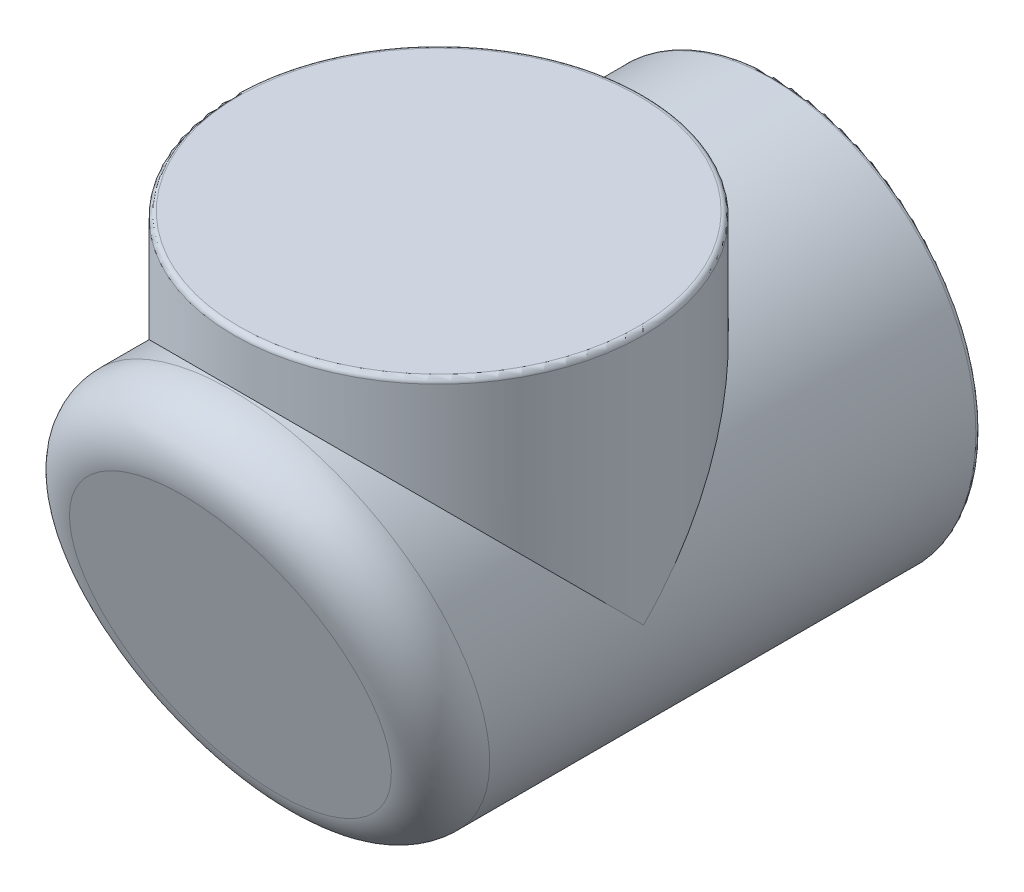
ISO-10303-21;
HEADER;
FILE_DESCRIPTION(('STEP AP214'),'2;1');
FILE_NAME('part.step','',(''),(''),'','','');
FILE_SCHEMA(('AUTOMOTIVE_DESIGN { 1 0 10303 214 1 1 1 1 }'));
ENDSEC;
DATA;
#1=APPLICATION_CONTEXT('core data for automotive mechanical design processes');
#2=APPLICATION_PROTOCOL_DEFINITION('international standard','automotive_design',2000,#1);
#3=PRODUCT_CONTEXT('',#1,'mechanical');
#4=PRODUCT('Part','Part','',(#3));
#5=PRODUCT_RELATED_PRODUCT_CATEGORY('part','',(#4));
#6=PRODUCT_DEFINITION_FORMATION('','',#4);
#7=PRODUCT_DEFINITION_CONTEXT('part definition',#1,'design');
#8=PRODUCT_DEFINITION('design','',#6,#7);
#9=PRODUCT_DEFINITION_SHAPE('','',#8);
#10=(LENGTH_UNIT() NAMED_UNIT(*) SI_UNIT(.MILLI.,.METRE.));
#11=(NAMED_UNIT(*) PLANE_ANGLE_UNIT() SI_UNIT($,.RADIAN.));
#12=(NAMED_UNIT(*) SI_UNIT($,.STERADIAN.) SOLID_ANGLE_UNIT());
#13=UNCERTAINTY_MEASURE_WITH_UNIT(LENGTH_MEASURE(1.E-05),#10,'distance_accuracy_value','');
#14=(GEOMETRIC_REPRESENTATION_CONTEXT(3) GLOBAL_UNCERTAINTY_ASSIGNED_CONTEXT((#13)) GLOBAL_UNIT_ASSIGNED_CONTEXT((#10,
#11,#12)) REPRESENTATION_CONTEXT('',''));
#15=CARTESIAN_POINT('',(0.,0.,0.));
#16=DIRECTION('',(0.,0.,1.));
#17=DIRECTION('',(1.,0.,0.));
#18=AXIS2_PLACEMENT_3D('',#15,#16,#17);
#19=CARTESIAN_POINT('',(0.,0.,60.));
#20=DIRECTION('',(0.,0.,-1.));
#21=DIRECTION('',(-1.,0.,0.));
#22=AXIS2_PLACEMENT_3D('',#19,#20,#21);
#23=CYLINDRICAL_SURFACE('',#22,40.);
#24=CARTESIAN_POINT('',(0.,0.,-59.));
#25=DIRECTION('',(0.,0.,1.));
#26=DIRECTION('',(1.,0.,0.));
#27=AXIS2_PLACEMENT_3D('',#24,#25,#26);
#28=CIRCLE('',#27,40.);
#29=CARTESIAN_POINT('',(40.,0.,-59.));
#30=VERTEX_POINT('',#29);
#31=EDGE_CURVE('E42',#30,#30,#28,.T.);
#32=ORIENTED_EDGE('',*,*,#31,.T.);
#33=EDGE_LOOP('',(#32));
#34=FACE_BOUND('',#33,.T.);
#35=CARTESIAN_POINT('',(0.,0.,37.0230908660999));
#36=DIRECTION('',(0.,-0.228191322789328,0.973616310567801));
#37=DIRECTION('',(0.,-0.973616310567801,-0.228191322789328));
#38=AXIS2_PLACEMENT_3D('',#35,#36,#37);
#39=ELLIPSE('',#38,41.083946073862,40.);
#40=CARTESIAN_POINT('',(0.,-40.,27.6480908660999));
#41=VERTEX_POINT('',#40);
#42=EDGE_CURVE('E58',#41,#41,#39,.F.);
#43=ORIENTED_EDGE('',*,*,#42,.T.);
#44=EDGE_LOOP('',(#43));
#45=FACE_BOUND('',#44,.T.);
#46=CARTESIAN_POINT('',(0.,0.,5.9));
#47=DIRECTION('',(0.,-0.707106781186547,-0.707106781186547));
#48=DIRECTION('',(0.,0.707106781186547,-0.707106781186547));
#49=AXIS2_PLACEMENT_3D('',#46,#47,#48);
#50=ELLIPSE('',#49,56.5685424949238,40.);
#51=CARTESIAN_POINT('',(40.,0.,5.9));
#52=VERTEX_POINT('',#51);
#53=CARTESIAN_POINT('',(-40.,0.,5.9));
#54=VERTEX_POINT('',#53);
#55=EDGE_CURVE('E50',#52,#54,#50,.F.);
#56=ORIENTED_EDGE('',*,*,#55,.F.);
#57=CARTESIAN_POINT('',(0.,0.,5.9));
#58=DIRECTION('',(0.,0.707106781186547,-0.707106781186547));
#59=DIRECTION('',(0.,-0.707106781186547,-0.707106781186547));
#60=AXIS2_PLACEMENT_3D('',#57,#58,#59);
#61=ELLIPSE('',#60,56.5685424949238,40.);
#62=EDGE_CURVE('E48',#54,#52,#61,.T.);
#63=ORIENTED_EDGE('',*,*,#62,.F.);
#64=EDGE_LOOP('',(#56,#63));
#65=FACE_BOUND('',#64,.T.);
#66=ADVANCED_FACE('F34',(#34,#45,#65),#23,.T.);
#67=CARTESIAN_POINT('',(0.,0.,-60.));
#68=DIRECTION('',(0.,0.,1.));
#69=DIRECTION('',(1.,0.,0.));
#70=AXIS2_PLACEMENT_3D('',#67,#68,#69);
#71=PLANE('',#70);
#72=CARTESIAN_POINT('',(0.,0.,-60.));
#73=DIRECTION('',(0.,0.,1.));
#74=DIRECTION('',(1.,0.,0.));
#75=AXIS2_PLACEMENT_3D('',#72,#73,#74);
#76=CIRCLE('',#75,39.);
#77=CARTESIAN_POINT('',(39.,0.,-60.));
#78=VERTEX_POINT('',#77);
#79=EDGE_CURVE('E11',#78,#78,#76,.F.);
#80=ORIENTED_EDGE('',*,*,#79,.T.);
#81=EDGE_LOOP('',(#80));
#82=FACE_BOUND('',#81,.T.);
#83=ADVANCED_FACE('F82',(#82),#71,.F.);
#84=CARTESIAN_POINT('',(-40.,40.,60.));
#85=DIRECTION('',(0.,0.298274993135947,-0.95447997803503));
#86=DIRECTION('',(0.,0.95447997803503,0.298274993135947));
#87=AXIS2_PLACEMENT_3D('',#84,#85,#86);
#88=PLANE('',#87);
#89=CARTESIAN_POINT('',(0.,-2.98274993135947,46.5678906464502));
#90=DIRECTION('',(0.,0.298274993135947,-0.95447997803503));
#91=DIRECTION('',(0.,-0.95447997803503,-0.298274993135947));
#92=AXIS2_PLACEMENT_3D('',#89,#90,#91);
#93=ELLIPSE('',#92,31.4307274017004,30.);
#94=CARTESIAN_POINT('',(0.,-32.9827499313595,37.1928906464502));
#95=VERTEX_POINT('',#94);
#96=EDGE_CURVE('E55',#95,#95,#93,.F.);
#97=ORIENTED_EDGE('',*,*,#96,.T.);
#98=EDGE_LOOP('',(#97));
#99=FACE_BOUND('',#98,.T.);
#100=ADVANCED_FACE('F88',(#99),#88,.F.);
#101=CARTESIAN_POINT('',(0.,-32.9827499313595,37.1928906464502));
#102=CARTESIAN_POINT('',(0.,-40.,35.));
#103=CARTESIAN_POINT('',(0.,-40.,27.6480908660999));
#104=CARTESIAN_POINT('',(-1.30935638610944,-32.9827499313595,37.1928906464502));
#105=CARTESIAN_POINT('',(-1.64553165599659,-40.,35.));
#106=CARTESIAN_POINT('',(-1.74580851481259,-40.,27.6480908660999));
#107=CARTESIAN_POINT('',(-2.61871277221887,-32.8968577282588,37.2197319599191));
#108=CARTESIAN_POINT('',(-3.29214553734941,-39.8985299500336,35.0317093906145));
#109=CARTESIAN_POINT('',(-3.49161702962517,-39.8854770625324,27.6749321795688));
#110=CARTESIAN_POINT('',(-5.2149956864827,-32.5550524868643,37.3265460978549));
#111=CARTESIAN_POINT('',(-6.55898026655954,-39.4949007050514,35.1578435296714));
#112=CARTESIAN_POINT('',(-6.95332758197693,-39.4297367406731,27.7817463175046));
#113=CARTESIAN_POINT('',(-6.50188170756395,-32.2988595726736,37.4066063835395));
#114=CARTESIAN_POINT('',(-8.18125247840322,-39.1918828804606,35.2525365998561));
#115=CARTESIAN_POINT('',(-8.66917561008527,-39.0881461884188,27.8618066031892));
#116=CARTESIAN_POINT('',(-9.03126353561858,-31.6211173965875,37.6184008135664));
#117=CARTESIAN_POINT('',(-11.3757042686667,-38.390097335717,35.5030945825884));
#118=CARTESIAN_POINT('',(-12.0416847141581,-38.1844899536374,28.0736010332161));
#119=CARTESIAN_POINT('',(-10.2736057016959,-31.1990465540532,37.7502979518584));
#120=CARTESIAN_POINT('',(-12.9496096479929,-37.8896848646044,35.6594734798111));
#121=CARTESIAN_POINT('',(-13.6981409355945,-37.6217288302583,28.2054981715081));
#122=CARTESIAN_POINT('',(-12.6927729981725,-30.1969998015681,38.06343756201));
#123=CARTESIAN_POINT('',(-16.0244233051664,-36.7006066306024,36.0310604279367));
#124=CARTESIAN_POINT('',(-16.9236973308967,-36.2856664936115,28.5186377816597));
#125=CARTESIAN_POINT('',(-13.8692818452536,-29.6163293083636,38.2448970911364));
#126=CARTESIAN_POINT('',(-17.5265575466598,-36.0096440197238,36.2469862438363));
#127=CARTESIAN_POINT('',(-18.4923757936715,-35.5114391693388,28.7000973107861));
#128=CARTESIAN_POINT('',(-16.1368256497262,-28.3071686346603,38.6540098016687));
#129=CARTESIAN_POINT('',(-20.4359462819638,-34.4493679358755,36.7345725200389));
#130=CARTESIAN_POINT('',(-21.5157675329683,-33.7658916044011,29.1092100213184));
#131=CARTESIAN_POINT('',(-17.2273646007139,-27.5778969577864,38.8819072006917));
#132=CARTESIAN_POINT('',(-21.8438076480218,-33.5772820138067,37.0070993706854));
#133=CARTESIAN_POINT('',(-22.9698194676186,-32.7935293685693,29.3371074203414));
#134=CARTESIAN_POINT('',(-19.3044908293619,-25.9840691745792,39.379978382944));
#135=CARTESIAN_POINT('',(-24.5439793690576,-31.666907541123,37.604091393399));
#136=CARTESIAN_POINT('',(-25.7393211058159,-30.6684256576263,29.8351786025937));
#137=CARTESIAN_POINT('',(-20.2904200162442,-25.1187328932266,39.6503959708667));
#138=CARTESIAN_POINT('',(-25.8362200728762,-30.6255675262048,37.929510148061));
#139=CARTESIAN_POINT('',(-27.0538933549923,-29.5146439491562,30.1055961905164));
#140=CARTESIAN_POINT('',(-22.1416114172217,-23.2675493021413,40.2288908430808));
#141=CARTESIAN_POINT('',(-28.2858480606177,-28.3909194099158,38.6278376844013));
#142=CARTESIAN_POINT('',(-29.5221485562956,-27.0463991610424,30.6840910627305));
#143=CARTESIAN_POINT('',(-23.0061015114356,-22.2809996005749,40.5371876248203));
#144=CARTESIAN_POINT('',(-29.4424908688153,-27.1944765846423,39.0017260672993));
#145=CARTESIAN_POINT('',(-30.6748020152475,-25.7309995589539,30.99238784447));
#146=CARTESIAN_POINT('',(-24.5997206718651,-20.2041628238046,41.1861991175611));
#147=CARTESIAN_POINT('',(-31.6031205193268,-24.6657912558066,39.7919402325604));
#148=CARTESIAN_POINT('',(-32.7996275624868,-22.9618838565935,31.6413993372108));
#149=CARTESIAN_POINT('',(-25.3280330602579,-19.1133056712815,41.5270919777245));
#150=CARTESIAN_POINT('',(-32.6057393787965,-23.3305097064912,40.2092157167215));
#151=CARTESIAN_POINT('',(-33.7707107470106,-21.5074076532294,31.9822921973742));
#152=CARTESIAN_POINT('',(-26.6368573625552,-16.8463637907465,42.2355113153917));
#153=CARTESIAN_POINT('',(-34.4421284170917,-20.5421094615005,41.0805907932811));
#154=CARTESIAN_POINT('',(-35.5158098167402,-18.4848184791827,32.6907115350414));
#155=CARTESIAN_POINT('',(-27.2165876830639,-15.6698685469287,42.6031660790848));
#156=CARTESIAN_POINT('',(-35.2739952907178,-19.0861999753484,41.5355625077036));
#157=CARTESIAN_POINT('',(-36.2887835774185,-16.9161581540923,33.0583662987345));
#158=CARTESIAN_POINT('',(-28.2182682861316,-13.2516060093167,43.3588731220885));
#159=CARTESIAN_POINT('',(-36.7543924793291,-16.0761798124088,42.4761938086222));
#160=CARTESIAN_POINT('',(-37.6243577148421,-13.691808103943,33.8140733417382));
#161=CARTESIAN_POINT('',(-28.6395505907276,-12.0095870046075,43.7470040610602));
#162=CARTESIAN_POINT('',(-37.4005965643796,-14.5196494114963,42.9626095589074));
#163=CARTESIAN_POINT('',(-38.1860674543035,-12.0357827643307,34.2022042807099));
#164=CARTESIAN_POINT('',(-29.3169885688124,-9.48136240543259,44.5370742483023));
#165=CARTESIAN_POINT('',(-38.496974054603,-11.3296027599305,43.9594991375217));
#166=CARTESIAN_POINT('',(-39.0893180917499,-8.66481663209749,34.992274467952));
#167=CARTESIAN_POINT('',(-29.5726575056061,-8.19503816126769,44.9390505746039));
#168=CARTESIAN_POINT('',(-38.9445247387954,-9.69413208524241,44.4705837233617));
#169=CARTESIAN_POINT('',(-39.4302100074748,-6.94971763987762,35.3942507942536));
#170=CARTESIAN_POINT('',(-29.9142913628965,-5.60007971874906,45.7499750878909));
#171=CARTESIAN_POINT('',(-39.6327922992173,-6.3689401062826,45.5097062167867));
#172=CARTESIAN_POINT('',(-39.8857218171953,-3.48977304985279,36.2051753075406));
#173=CARTESIAN_POINT('',(-30.,-4.29141482505427,46.1589328671705));
#174=CARTESIAN_POINT('',(-39.8707239283263,-4.6777990000629,46.0381878124804));
#175=CARTESIAN_POINT('',(-40.,-1.7448865249264,36.6141330868202));
#176=CARTESIAN_POINT('',(-30.,-1.67408503766467,46.9768484257298));
#177=CARTESIAN_POINT('',(-40.1309691506179,-1.26550145753454,47.1045307945205));
#178=CARTESIAN_POINT('',(-40.,1.74488652492639,37.4320486453795));
#179=CARTESIAN_POINT('',(-29.9142913628965,-0.365420143969878,47.3858062050094));
#180=CARTESIAN_POINT('',(-40.1504737202481,0.456491777526937,47.6426536804772));
#181=CARTESIAN_POINT('',(-39.8857218171953,3.48977304985279,37.8410064246591));
#182=CARTESIAN_POINT('',(-29.5726575056061,2.22953829854875,48.1967307182965));
#183=CARTESIAN_POINT('',(-39.967289466983,3.9047407891704,48.7202314966157));
#184=CARTESIAN_POINT('',(-39.4302100074748,6.94971763987762,38.6519309379462));
#185=CARTESIAN_POINT('',(-29.3169885688124,3.51586254271365,48.598707044598));
#186=CARTESIAN_POINT('',(-39.7619115617362,5.63122053716725,49.2597564178648));
#187=CARTESIAN_POINT('',(-39.0893180917499,8.66481663209749,39.0539072642477));
#188=CARTESIAN_POINT('',(-28.6395505907276,6.04408714188855,49.3887772318402));
#189=CARTESIAN_POINT('',(-39.1248867346976,9.0611346022987,50.3316045632183));
#190=CARTESIAN_POINT('',(-38.1860674543034,12.0357827643307,39.8439774514899));
#191=CARTESIAN_POINT('',(-28.2182682861316,7.28610614659777,49.7769081708118));
#192=CARTESIAN_POINT('',(-38.6908209095681,10.7641693939756,50.8638029356174));
#193=CARTESIAN_POINT('',(-37.6243577148421,13.691808103943,40.2321083904615));
#194=CARTESIAN_POINT('',(-27.2165876830639,9.70436868420973,50.5326152138155));
#195=CARTESIAN_POINT('',(-37.5952763436176,14.1183113647629,51.9119723014884));
#196=CARTESIAN_POINT('',(-36.2887835774185,16.9161581540923,40.9878154334652));
#197=CARTESIAN_POINT('',(-26.6368573625552,10.8808639280275,50.9002699775086));
#198=CARTESIAN_POINT('',(-36.9318064263113,15.7684082765183,52.427627586412));
#199=CARTESIAN_POINT('',(-35.5158098167402,18.4848184791827,41.3554701971583));
#200=CARTESIAN_POINT('',(-25.3280330602579,13.1478058085626,51.6086893151758));
#201=CARTESIAN_POINT('',(-35.3798441294069,18.9862849052392,53.4332140328873));
#202=CARTESIAN_POINT('',(-33.7707107470106,21.5074076532294,42.0638895348255));
#203=CARTESIAN_POINT('',(-24.5997206718651,14.2386629610857,51.9495821753393));
#204=CARTESIAN_POINT('',(-34.4899506994234,20.5524874562383,53.9226523300745));
#205=CARTESIAN_POINT('',(-32.7996275624868,22.9618838565935,42.404782394989));
#206=CARTESIAN_POINT('',(-23.0061015114356,16.315499737856,52.59859366808));
#207=CARTESIAN_POINT('',(-32.4918392566411,23.5709270551441,54.8659147047325));
#208=CARTESIAN_POINT('',(-30.6748020152475,25.7309995589539,43.0537938877297));
#209=CARTESIAN_POINT('',(-22.1416114172217,17.3020494394224,52.9068904498195));
#210=CARTESIAN_POINT('',(-31.3829694331091,25.0211044741946,55.3190951481858));
#211=CARTESIAN_POINT('',(-29.5221485562956,27.0463991610424,43.3620906694692));
#212=CARTESIAN_POINT('',(-20.2904200162442,19.1532330305077,53.4853853220336));
#213=CARTESIAN_POINT('',(-28.9588006855775,27.775131628244,56.1797286338263));
#214=CARTESIAN_POINT('',(-27.0538933549923,29.5146439491562,43.9405855416833));
#215=CARTESIAN_POINT('',(-19.3044908293619,20.0185693118602,53.7558029099563));
#216=CARTESIAN_POINT('',(-27.6437395585789,29.0765726183602,56.5864289432376));
#217=CARTESIAN_POINT('',(-25.7393211058159,30.6684256576263,44.211003129606));
#218=CARTESIAN_POINT('',(-17.2273646007139,21.6123970950675,54.2538740922086));
#219=CARTESIAN_POINT('',(-24.8251615869309,31.5009973325456,57.3440616664205));
#220=CARTESIAN_POINT('',(-22.9698194676186,32.7935293685693,44.7090743118583));
#221=CARTESIAN_POINT('',(-16.1368256497262,22.3416687719414,54.4817714912317));
#222=CARTESIAN_POINT('',(-23.3228711701853,32.621408291759,57.6941900911747));
#223=CARTESIAN_POINT('',(-21.5157675329683,33.7658916044011,44.9369717108814));
#224=CARTESIAN_POINT('',(-13.8692818452536,23.6508294456446,54.890884201764));
#225=CARTESIAN_POINT('',(-20.1545515156069,34.6532763379523,58.3291488556101));
#226=CARTESIAN_POINT('',(-18.4923757936715,35.5114391693388,45.3460844214137));
#227=CARTESIAN_POINT('',(-12.6927729981725,24.2314999388491,55.0723437308904));
#228=CARTESIAN_POINT('',(-18.4907683442773,35.5622262171682,58.6131956928651));
#229=CARTESIAN_POINT('',(-16.9236973308967,36.2856664936115,45.5275439505401));
#230=CARTESIAN_POINT('',(-10.2736057016959,25.2335466913342,55.3854833410419));
#231=CARTESIAN_POINT('',(-15.031119505139,37.1441104057789,59.1075345018059));
#232=CARTESIAN_POINT('',(-13.6981409355945,37.6217288302583,45.8406835606917));
#233=CARTESIAN_POINT('',(-9.03126353561859,25.6556175338686,55.5173804793339));
#234=CARTESIAN_POINT('',(-13.2384581639586,37.8148565962277,59.3171426863212));
#235=CARTESIAN_POINT('',(-12.0416847141581,38.1844899536374,45.9725806989836));
#236=CARTESIAN_POINT('',(-6.50188170756396,26.3333597099547,55.7291749093608));
#237=CARTESIAN_POINT('',(-9.55913691126145,38.898717466338,59.6558492082307));
#238=CARTESIAN_POINT('',(-8.66917561008528,39.0881461884188,46.1843751290105));
#239=CARTESIAN_POINT('',(-5.21499568648271,26.5895526241453,55.8092351950454));
#240=CARTESIAN_POINT('',(-7.67647237750468,39.3102073714614,59.7844398035817));
#241=CARTESIAN_POINT('',(-6.95332758197695,39.4297367406731,46.2644354146951));
#242=CARTESIAN_POINT('',(-2.61871277221888,26.9313578655399,55.9160493329812));
#243=CARTESIAN_POINT('',(-3.86030968965784,39.8612819538454,59.9566506105767));
#244=CARTESIAN_POINT('',(-3.49161702962518,39.8854770625324,46.3712495526309));
#245=CARTESIAN_POINT('',(-1.30935638610944,27.0172500686405,55.9428906464502));
#246=CARTESIAN_POINT('',(-1.93133039503273,40.,60.));
#247=CARTESIAN_POINT('',(-1.74580851481259,40.,46.3980908660999));
#248=CARTESIAN_POINT('',(1.30935638610944,27.0172500686405,55.9428906464502));
#249=CARTESIAN_POINT('',(1.93133039503272,40.,60.));
#250=CARTESIAN_POINT('',(1.74580851481258,40.,46.3980908660999));
#251=CARTESIAN_POINT('',(2.61871277221888,26.9313578655399,55.9160493329812));
#252=CARTESIAN_POINT('',(3.86030968965783,39.8612819538454,59.9566506105767));
#253=CARTESIAN_POINT('',(3.49161702962517,39.8854770625324,46.3712495526309));
#254=CARTESIAN_POINT('',(5.21499568648271,26.5895526241453,55.8092351950454));
#255=CARTESIAN_POINT('',(7.67647237750468,39.3102073714614,59.7844398035817));
#256=CARTESIAN_POINT('',(6.95332758197694,39.4297367406731,46.2644354146951));
#257=CARTESIAN_POINT('',(6.50188170756395,26.3333597099547,55.7291749093608));
#258=CARTESIAN_POINT('',(9.55913691126144,38.898717466338,59.6558492082307));
#259=CARTESIAN_POINT('',(8.66917561008527,39.0881461884188,46.1843751290105));
#260=CARTESIAN_POINT('',(9.03126353561858,25.6556175338686,55.5173804793339));
#261=CARTESIAN_POINT('',(13.2384581639586,37.8148565962277,59.3171426863212));
#262=CARTESIAN_POINT('',(12.0416847141581,38.1844899536374,45.9725806989836));
#263=CARTESIAN_POINT('',(10.2736057016959,25.2335466913342,55.3854833410419));
#264=CARTESIAN_POINT('',(15.031119505139,37.1441104057789,59.1075345018059));
#265=CARTESIAN_POINT('',(13.6981409355945,37.6217288302583,45.8406835606917));
#266=CARTESIAN_POINT('',(12.6927729981725,24.2314999388491,55.0723437308904));
#267=CARTESIAN_POINT('',(18.4907683442773,35.5622262171682,58.6131956928651));
#268=CARTESIAN_POINT('',(16.9236973308967,36.2856664936115,45.5275439505401));
#269=CARTESIAN_POINT('',(13.8692818452536,23.6508294456447,54.890884201764));
#270=CARTESIAN_POINT('',(20.1545515156069,34.6532763379523,58.3291488556101));
#271=CARTESIAN_POINT('',(18.4923757936714,35.5114391693388,45.3460844214137));
#272=CARTESIAN_POINT('',(16.1368256497262,22.3416687719414,54.4817714912317));
#273=CARTESIAN_POINT('',(23.3228711701852,32.621408291759,57.6941900911747));
#274=CARTESIAN_POINT('',(21.5157675329683,33.7658916044011,44.9369717108814));
#275=CARTESIAN_POINT('',(17.2273646007139,21.6123970950675,54.2538740922086));
#276=CARTESIAN_POINT('',(24.8251615869308,31.5009973325456,57.3440616664205));
#277=CARTESIAN_POINT('',(22.9698194676186,32.7935293685693,44.7090743118583));
#278=CARTESIAN_POINT('',(19.3044908293619,20.0185693118602,53.7558029099563));
#279=CARTESIAN_POINT('',(27.6437395585789,29.0765726183602,56.5864289432376));
#280=CARTESIAN_POINT('',(25.7393211058159,30.6684256576263,44.211003129606));
#281=CARTESIAN_POINT('',(20.2904200162442,19.1532330305077,53.4853853220337));
#282=CARTESIAN_POINT('',(28.9588006855775,27.775131628244,56.1797286338263));
#283=CARTESIAN_POINT('',(27.0538933549923,29.5146439491562,43.9405855416833));
#284=CARTESIAN_POINT('',(22.1416114172217,17.3020494394224,52.9068904498195));
#285=CARTESIAN_POINT('',(31.3829694331091,25.0211044741946,55.3190951481858));
#286=CARTESIAN_POINT('',(29.5221485562956,27.0463991610425,43.3620906694692));
#287=CARTESIAN_POINT('',(23.0061015114356,16.315499737856,52.59859366808));
#288=CARTESIAN_POINT('',(32.491839256641,23.5709270551441,54.8659147047325));
#289=CARTESIAN_POINT('',(30.6748020152474,25.7309995589539,43.0537938877297));
#290=CARTESIAN_POINT('',(24.5997206718651,14.2386629610857,51.9495821753393));
#291=CARTESIAN_POINT('',(34.4899506994234,20.5524874562383,53.9226523300745));
#292=CARTESIAN_POINT('',(32.7996275624868,22.9618838565935,42.404782394989));
#293=CARTESIAN_POINT('',(25.3280330602579,13.1478058085626,51.6086893151758));
#294=CARTESIAN_POINT('',(35.3798441294069,18.9862849052392,53.4332140328873));
#295=CARTESIAN_POINT('',(33.7707107470106,21.5074076532294,42.0638895348255));
#296=CARTESIAN_POINT('',(26.6368573625552,10.8808639280276,50.9002699775086));
#297=CARTESIAN_POINT('',(36.9318064263113,15.7684082765183,52.427627586412));
#298=CARTESIAN_POINT('',(35.5158098167402,18.4848184791827,41.3554701971583));
#299=CARTESIAN_POINT('',(27.2165876830639,9.70436868420974,50.5326152138155));
#300=CARTESIAN_POINT('',(37.5952763436176,14.1183113647629,51.9119723014884));
#301=CARTESIAN_POINT('',(36.2887835774185,16.9161581540923,40.9878154334652));
#302=CARTESIAN_POINT('',(28.2182682861316,7.28610614659777,49.7769081708118));
#303=CARTESIAN_POINT('',(38.6908209095681,10.7641693939756,50.8638029356174));
#304=CARTESIAN_POINT('',(37.6243577148421,13.691808103943,40.2321083904615));
#305=CARTESIAN_POINT('',(28.6395505907276,6.04408714188855,49.3887772318402));
#306=CARTESIAN_POINT('',(39.1248867346976,9.06113460229869,50.3316045632183));
#307=CARTESIAN_POINT('',(38.1860674543035,12.0357827643307,39.8439774514899));
#308=CARTESIAN_POINT('',(29.3169885688124,3.51586254271364,48.598707044598));
#309=CARTESIAN_POINT('',(39.7619115617362,5.63122053716725,49.2597564178648));
#310=CARTESIAN_POINT('',(39.0893180917499,8.66481663209748,39.0539072642477));
#311=CARTESIAN_POINT('',(29.5726575056061,2.22953829854875,48.1967307182965));
#312=CARTESIAN_POINT('',(39.967289466983,3.9047407891704,48.7202314966157));
#313=CARTESIAN_POINT('',(39.4302100074748,6.94971763987762,38.6519309379462));
#314=CARTESIAN_POINT('',(29.9142913628965,-0.365420143969874,47.3858062050094));
#315=CARTESIAN_POINT('',(40.1504737202481,0.456491777526944,47.6426536804772));
#316=CARTESIAN_POINT('',(39.8857218171953,3.48977304985279,37.8410064246591));
#317=CARTESIAN_POINT('',(30.,-1.67408503766467,46.9768484257298));
#318=CARTESIAN_POINT('',(40.1309691506179,-1.26550145753453,47.1045307945204));
#319=CARTESIAN_POINT('',(40.,1.7448865249264,37.4320486453795));
#320=CARTESIAN_POINT('',(30.,-4.29141482505426,46.1589328671705));
#321=CARTESIAN_POINT('',(39.8707239283263,-4.67779900006289,46.0381878124804));
#322=CARTESIAN_POINT('',(40.,-1.74488652492639,36.6141330868202));
#323=CARTESIAN_POINT('',(29.9142913628965,-5.60007971874905,45.7499750878909));
#324=CARTESIAN_POINT('',(39.6327922992173,-6.36894010628259,45.5097062167867));
#325=CARTESIAN_POINT('',(39.8857218171953,-3.48977304985278,36.2051753075406));
#326=CARTESIAN_POINT('',(29.5726575056061,-8.19503816126767,44.9390505746039));
#327=CARTESIAN_POINT('',(38.9445247387954,-9.69413208524239,44.4705837233617));
#328=CARTESIAN_POINT('',(39.4302100074748,-6.94971763987761,35.3942507942536));
#329=CARTESIAN_POINT('',(29.3169885688124,-9.48136240543257,44.5370742483023));
#330=CARTESIAN_POINT('',(38.496974054603,-11.3296027599305,43.9594991375217));
#331=CARTESIAN_POINT('',(39.0893180917499,-8.66481663209747,34.992274467952));
#332=CARTESIAN_POINT('',(28.6395505907276,-12.0095870046075,43.7470040610602));
#333=CARTESIAN_POINT('',(37.4005965643796,-14.5196494114963,42.9626095589074));
#334=CARTESIAN_POINT('',(38.1860674543035,-12.0357827643307,34.2022042807099));
#335=CARTESIAN_POINT('',(28.2182682861316,-13.2516060093167,43.3588731220885));
#336=CARTESIAN_POINT('',(36.7543924793291,-16.0761798124088,42.4761938086223));
#337=CARTESIAN_POINT('',(37.6243577148421,-13.691808103943,33.8140733417382));
#338=CARTESIAN_POINT('',(27.2165876830639,-15.6698685469287,42.6031660790848));
#339=CARTESIAN_POINT('',(35.2739952907178,-19.0861999753484,41.5355625077036));
#340=CARTESIAN_POINT('',(36.2887835774185,-16.9161581540923,33.0583662987345));
#341=CARTESIAN_POINT('',(26.6368573625552,-16.8463637907465,42.2355113153917));
#342=CARTESIAN_POINT('',(34.4421284170917,-20.5421094615005,41.0805907932811));
#343=CARTESIAN_POINT('',(35.5158098167402,-18.4848184791827,32.6907115350414));
#344=CARTESIAN_POINT('',(25.3280330602579,-19.1133056712815,41.5270919777245));
#345=CARTESIAN_POINT('',(32.6057393787965,-23.3305097064912,40.2092157167215));
#346=CARTESIAN_POINT('',(33.7707107470106,-21.5074076532294,31.9822921973742));
#347=CARTESIAN_POINT('',(24.5997206718651,-20.2041628238046,41.1861991175611));
#348=CARTESIAN_POINT('',(31.6031205193268,-24.6657912558066,39.7919402325604));
#349=CARTESIAN_POINT('',(32.7996275624868,-22.9618838565935,31.6413993372108));
#350=CARTESIAN_POINT('',(23.0061015114356,-22.2809996005749,40.5371876248203));
#351=CARTESIAN_POINT('',(29.4424908688153,-27.1944765846423,39.0017260672993));
#352=CARTESIAN_POINT('',(30.6748020152475,-25.7309995589539,30.9923878444701));
#353=CARTESIAN_POINT('',(22.1416114172217,-23.2675493021413,40.2288908430808));
#354=CARTESIAN_POINT('',(28.2858480606177,-28.3909194099158,38.6278376844013));
#355=CARTESIAN_POINT('',(29.5221485562956,-27.0463991610424,30.6840910627306));
#356=CARTESIAN_POINT('',(20.2904200162442,-25.1187328932266,39.6503959708667));
#357=CARTESIAN_POINT('',(25.8362200728762,-30.6255675262048,37.929510148061));
#358=CARTESIAN_POINT('',(27.0538933549923,-29.5146439491562,30.1055961905164));
#359=CARTESIAN_POINT('',(19.3044908293619,-25.9840691745792,39.379978382944));
#360=CARTESIAN_POINT('',(24.5439793690576,-31.666907541123,37.6040913933991));
#361=CARTESIAN_POINT('',(25.7393211058159,-30.6684256576263,29.8351786025937));
#362=CARTESIAN_POINT('',(17.2273646007139,-27.5778969577864,38.8819072006917));
#363=CARTESIAN_POINT('',(21.8438076480218,-33.5772820138066,37.0070993706854));
#364=CARTESIAN_POINT('',(22.9698194676186,-32.7935293685693,29.3371074203414));
#365=CARTESIAN_POINT('',(16.1368256497262,-28.3071686346603,38.6540098016687));
#366=CARTESIAN_POINT('',(20.4359462819638,-34.4493679358755,36.7345725200389));
#367=CARTESIAN_POINT('',(21.5157675329683,-33.7658916044011,29.1092100213184));
#368=CARTESIAN_POINT('',(13.8692818452536,-29.6163293083636,38.2448970911364));
#369=CARTESIAN_POINT('',(17.5265575466598,-36.0096440197238,36.2469862438363));
#370=CARTESIAN_POINT('',(18.4923757936715,-35.5114391693388,28.7000973107861));
#371=CARTESIAN_POINT('',(12.6927729981725,-30.1969998015681,38.06343756201));
#372=CARTESIAN_POINT('',(16.0244233051664,-36.7006066306024,36.0310604279368));
#373=CARTESIAN_POINT('',(16.9236973308967,-36.2856664936115,28.5186377816597));
#374=CARTESIAN_POINT('',(10.2736057016959,-31.1990465540532,37.7502979518584));
#375=CARTESIAN_POINT('',(12.9496096479929,-37.8896848646044,35.6594734798111));
#376=CARTESIAN_POINT('',(13.6981409355945,-37.6217288302583,28.2054981715081));
#377=CARTESIAN_POINT('',(9.03126353561859,-31.6211173965875,37.6184008135664));
#378=CARTESIAN_POINT('',(11.3757042686667,-38.390097335717,35.5030945825884));
#379=CARTESIAN_POINT('',(12.0416847141581,-38.1844899536374,28.0736010332161));
#380=CARTESIAN_POINT('',(6.50188170756396,-32.2988595726736,37.4066063835395));
#381=CARTESIAN_POINT('',(8.18125247840324,-39.1918828804606,35.2525365998561));
#382=CARTESIAN_POINT('',(8.66917561008529,-39.0881461884188,27.8618066031892));
#383=CARTESIAN_POINT('',(5.21499568648271,-32.5550524868643,37.3265460978549));
#384=CARTESIAN_POINT('',(6.55898026655955,-39.4949007050514,35.1578435296714));
#385=CARTESIAN_POINT('',(6.95332758197695,-39.4297367406731,27.7817463175046));
#386=CARTESIAN_POINT('',(2.61871277221888,-32.8968577282588,37.2197319599191));
#387=CARTESIAN_POINT('',(3.29214553734942,-39.8985299500336,35.0317093906145));
#388=CARTESIAN_POINT('',(3.49161702962517,-39.8854770625324,27.6749321795688));
#389=CARTESIAN_POINT('',(1.30935638610944,-32.9827499313595,37.1928906464502));
#390=CARTESIAN_POINT('',(1.64553165599659,-40.,35.));
#391=CARTESIAN_POINT('',(1.74580851481258,-40.,27.6480908660999));
#392=CARTESIAN_POINT('',(0.,-32.9827499313595,37.1928906464502));
#393=CARTESIAN_POINT('',(0.,-40.,35.));
#394=CARTESIAN_POINT('',(0.,-40.,27.6480908660999));
#395=(BOUNDED_SURFACE() B_SPLINE_SURFACE(3,2,((#101,#102,#103),(#104,#105,#106),(#107,#108,
#109),(#110,#111,#112),(#113,#114,#115),(#116,#117,#118),(#119,#120,#121),(#122,#123,#124),
(#125,#126,#127),(#128,#129,#130),(#131,#132,#133),(#134,#135,#136),(#137,#138,#139),(#140,#141,
#142),(#143,#144,#145),(#146,#147,#148),(#149,#150,#151),(#152,#153,#154),(#155,#156,#157),
(#158,#159,#160),(#161,#162,#163),(#164,#165,#166),(#167,#168,#169),(#170,#171,#172),(#173,#174,
#175),(#176,#177,#178),(#179,#180,#181),(#182,#183,#184),(#185,#186,#187),(#188,#189,#190),
(#191,#192,#193),(#194,#195,#196),(#197,#198,#199),(#200,#201,#202),(#203,#204,#205),(#206,#207,
#208),(#209,#210,#211),(#212,#213,#214),(#215,#216,#217),(#218,#219,#220),(#221,#222,#223),
(#224,#225,#226),(#227,#228,#229),(#230,#231,#232),(#233,#234,#235),(#236,#237,#238),(#239,#240,
#241),(#242,#243,#244),(#245,#246,#247),(#248,#249,#250),(#251,#252,#253),(#254,#255,#256),
(#257,#258,#259),(#260,#261,#262),(#263,#264,#265),(#266,#267,#268),(#269,#270,#271),(#272,#273,
#274),(#275,#276,#277),(#278,#279,#280),(#281,#282,#283),(#284,#285,#286),(#287,#288,#289),
(#290,#291,#292),(#293,#294,#295),(#296,#297,#298),(#299,#300,#301),(#302,#303,#304),(#305,#306,
#307),(#308,#309,#310),(#311,#312,#313),(#314,#315,#316),(#317,#318,#319),(#320,#321,#322),
(#323,#324,#325),(#326,#327,#328),(#329,#330,#331),(#332,#333,#334),(#335,#336,#337),(#338,#339,
#340),(#341,#342,#343),(#344,#345,#346),(#347,#348,#349),(#350,#351,#352),(#353,#354,#355),
(#356,#357,#358),(#359,#360,#361),(#362,#363,#364),(#365,#366,#367),(#368,#369,#370),(#371,#372,
#373),(#374,#375,#376),(#377,#378,#379),(#380,#381,#382),(#383,#384,#385),(#386,#387,#388),
(#389,#390,#391),(#392,#393,#394)),.UNSPECIFIED.,.T.,.F.,.F.) B_SPLINE_SURFACE_WITH_KNOTS((4,2,
2,2,2,2,2,2,2,2,2,2,2,2,2,2,2,2,2,2,2,2,2,2,2,2,2,2,2,2,2,2,2,2,2,2,2,2,2,2,2,2,2,2,2,2,2,2,4),
(3,3),(0.,3.92500729640977,7.85648103550222,11.8004169574313,15.7619101426584,19.7448010560814,
23.7514232260458,27.78246661493,31.8369594300291,35.9123617119292,40.0047572768319,
44.1091264433109,48.2196799022806,52.3302333612502,56.4346025277293,60.5269980926319,
64.602400374532,68.6568931896311,72.6879365785153,76.6945587484797,80.6774496619027,
84.6389428471299,88.5828787690589,92.5143525081513,96.4393598045611,100.364367100971,
104.295840840063,108.239776761992,112.20126994722,116.184160860643,120.190783030607,
124.221826419491,128.27631923459,132.35172151649,136.444117081393,140.548486247872,
144.659039706842,148.769593165811,152.87396233229,156.966357897193,161.041760179093,
165.096252994192,169.127296383076,173.133918553041,177.116809466464,181.078302651691,
185.02223857362,188.953712312712,192.878719609122),(0.,1.),
.UNSPECIFIED.) GEOMETRIC_REPRESENTATION_ITEM() RATIONAL_B_SPLINE_SURFACE(((1.,0.805690695346529,
1.),(1.,0.805690695346529,1.),(1.,0.805425841047138,1.),(1.,0.804370301733398,1.),(1.,
0.803578751132743,1.),(1.,0.801479620190375,1.),(1.,0.800170412065142,1.),(1.,0.797051612519167,
1.),(1.,0.795239819482093,1.),(1.,0.791137305942816,1.),(1.,0.788844051407298,1.),(1.,
0.783805895380141,1.),(1.,0.781058384254303,1.),(1.,0.775144886166206,1.),(1.,0.771976450578757,
1.),(1.,0.765260270605596,1.),(1.,0.76171042692057,1.),(1.,0.754276718364985,1.),(1.,
0.750391225321205,1.),(1.,0.742337743166316,1.),(1.,0.738168643681291,1.),(1.,0.729605786771033,
1.),(1.,0.72521140772691,1.),(1.,0.716262135343398,1.),(1.,0.711707010124406,1.),(1.,
0.702506552248689,1.),(1.,0.697861219591964,1.),(1.,0.688556475303303,1.),(1.,0.68389709536775,
1.),(1.,0.674645587668215,1.),(1.,0.670053303364504,1.),(1.,0.661021535711693,1.),(1.,
0.65658149705348,1.),(1.,0.647942544919553,1.),(1.,0.64374251119239,1.),(1.,0.635672692640101,
1.),(1.,0.631801138288291,1.),(1.,0.624475655140762,1.),(1.,0.621019338346505,1.),(1.,
0.614606877451692,1.),(1.,0.611647892078699,1.),(1.,0.60630433028997,1.),(1.,0.603916753317666,
1.),(1.,0.599778309433267,1.),(1.,0.598024667532038,1.),(1.,0.595201054848265,1.),(1.,
0.594128941287799,1.),(1.,0.592697237499362,1.),(1.,0.592336478221649,1.),(1.,0.592336478221649,
1.),(1.,0.592697237499362,1.),(1.,0.594128941287799,1.),(1.,0.595201054848265,1.),(1.,
0.598024667532038,1.),(1.,0.599778309433267,1.),(1.,0.603916753317666,1.),(1.,0.60630433028997,
1.),(1.,0.611647892078699,1.),(1.,0.614606877451692,1.),(1.,0.621019338346505,1.),(1.,
0.624475655140762,1.),(1.,0.631801138288291,1.),(1.,0.635672692640101,1.),(1.,0.64374251119239,
1.),(1.,0.647942544919553,1.),(1.,0.65658149705348,1.),(1.,0.661021535711693,1.),(1.,
0.670053303364504,1.),(1.,0.674645587668215,1.),(1.,0.68389709536775,1.),(1.,0.688556475303303,
1.),(1.,0.697861219591964,1.),(1.,0.702506552248689,1.),(1.,0.711707010124406,1.),(1.,
0.716262135343398,1.),(1.,0.72521140772691,1.),(1.,0.729605786771033,1.),(1.,0.73816864368129,
1.),(1.,0.742337743166316,1.),(1.,0.750391225321205,1.),(1.,0.754276718364985,1.),(1.,
0.76171042692057,1.),(1.,0.765260270605596,1.),(1.,0.771976450578757,1.),(1.,0.775144886166206,
1.),(1.,0.781058384254303,1.),(1.,0.783805895380141,1.),(1.,0.788844051407298,1.),(1.,
0.791137305942816,1.),(1.,0.795239819482093,1.),(1.,0.797051612519167,1.),(1.,0.800170412065142,
1.),(1.,0.801479620190375,1.),(1.,0.803578751132743,1.),(1.,0.804370301733398,1.),(1.,
0.805425841047138,1.),(1.,0.805690695346529,1.),(1.,0.805690695346529,1.))) REPRESENTATION_ITEM('') SURFACE());
#396=CARTESIAN_POINT('',(0.,-30.,27.6480908660999));
#397=DIRECTION('',(1.,0.,0.));
#398=DIRECTION('',(0.,-0.298274993135947,0.95447997803503));
#399=AXIS2_PLACEMENT_3D('',#396,#397,#398);
#400=CIRCLE('',#399,10.);
#401=EDGE_CURVE('',#95,#41,#400,.T.);
#402=ORIENTED_EDGE('',*,*,#96,.F.);
#403=ORIENTED_EDGE('',*,*,#42,.F.);
#404=ORIENTED_EDGE('',*,*,#401,.T.);
#405=ORIENTED_EDGE('',*,*,#401,.F.);
#406=EDGE_LOOP('',(#402,#404,#403,#405));
#407=FACE_BOUND('',#406,.T.);
#408=ADVANCED_FACE('F94',(#407),#395,.T.);
#409=CARTESIAN_POINT('',(0.,50.,5.9));
#410=DIRECTION('',(0.,-1.,0.));
#411=DIRECTION('',(0.,0.,-1.));
#412=AXIS2_PLACEMENT_3D('',#409,#410,#411);
#413=CYLINDRICAL_SURFACE('',#412,40.);
#414=CARTESIAN_POINT('',(0.,49.,5.9));
#415=DIRECTION('',(0.,1.,0.));
#416=DIRECTION('',(0.,0.,1.));
#417=AXIS2_PLACEMENT_3D('',#414,#415,#416);
#418=CIRCLE('',#417,40.);
#419=CARTESIAN_POINT('',(0.,49.,45.9));
#420=VERTEX_POINT('',#419);
#421=EDGE_CURVE('E65',#420,#420,#418,.F.);
#422=ORIENTED_EDGE('',*,*,#421,.T.);
#423=EDGE_LOOP('',(#422));
#424=FACE_BOUND('',#423,.T.);
#425=ORIENTED_EDGE('',*,*,#62,.T.);
#426=ORIENTED_EDGE('',*,*,#55,.T.);
#427=EDGE_LOOP('',(#425,#426));
#428=FACE_BOUND('',#427,.T.);
#429=ADVANCED_FACE('F54',(#424,#428),#413,.T.);
#430=CARTESIAN_POINT('',(0.,50.,5.9));
#431=DIRECTION('',(0.,1.,0.));
#432=DIRECTION('',(0.,0.,1.));
#433=AXIS2_PLACEMENT_3D('',#430,#431,#432);
#434=PLANE('',#433);
#435=CARTESIAN_POINT('',(0.,50.,5.9));
#436=DIRECTION('',(0.,1.,0.));
#437=DIRECTION('',(0.,0.,1.));
#438=AXIS2_PLACEMENT_3D('',#435,#436,#437);
#439=CIRCLE('',#438,39.);
#440=CARTESIAN_POINT('',(0.,50.,44.9));
#441=VERTEX_POINT('',#440);
#442=EDGE_CURVE('E52',#441,#441,#439,.T.);
#443=ORIENTED_EDGE('',*,*,#442,.T.);
#444=EDGE_LOOP('',(#443));
#445=FACE_BOUND('',#444,.T.);
#446=ADVANCED_FACE('F78',(#445),#434,.T.);
#447=CARTESIAN_POINT('',(0.,49.,5.9));
#448=DIRECTION('',(0.,1.,0.));
#449=DIRECTION('',(0.,0.,1.));
#450=AXIS2_PLACEMENT_3D('',#447,#448,#449);
#451=TOROIDAL_SURFACE('',#450,39.,1.);
#452=ORIENTED_EDGE('',*,*,#421,.F.);
#453=EDGE_LOOP('',(#452));
#454=FACE_BOUND('',#453,.T.);
#455=ORIENTED_EDGE('',*,*,#442,.F.);
#456=EDGE_LOOP('',(#455));
#457=FACE_BOUND('',#456,.T.);
#458=ADVANCED_FACE('F73',(#454,#457),#451,.T.);
#459=CARTESIAN_POINT('',(0.,0.,-59.));
#460=DIRECTION('',(0.,0.,1.));
#461=DIRECTION('',(1.,0.,0.));
#462=AXIS2_PLACEMENT_3D('',#459,#460,#461);
#463=TOROIDAL_SURFACE('',#462,39.,1.);
#464=ORIENTED_EDGE('',*,*,#79,.F.);
#465=EDGE_LOOP('',(#464));
#466=FACE_BOUND('',#465,.T.);
#467=ORIENTED_EDGE('',*,*,#31,.F.);
#468=EDGE_LOOP('',(#467));
#469=FACE_BOUND('',#468,.T.);
#470=ADVANCED_FACE('F36',(#466,#469),#463,.T.);
#471=CLOSED_SHELL('',(#66,#83,#100,#408,#429,#446,#458,#470));
#472=MANIFOLD_SOLID_BREP('B2',#471);
#473=ADVANCED_BREP_SHAPE_REPRESENTATION('',(#18,#472),#14);
#474=SHAPE_DEFINITION_REPRESENTATION(#9,#473);
ENDSEC;
END-ISO-10303-21;
